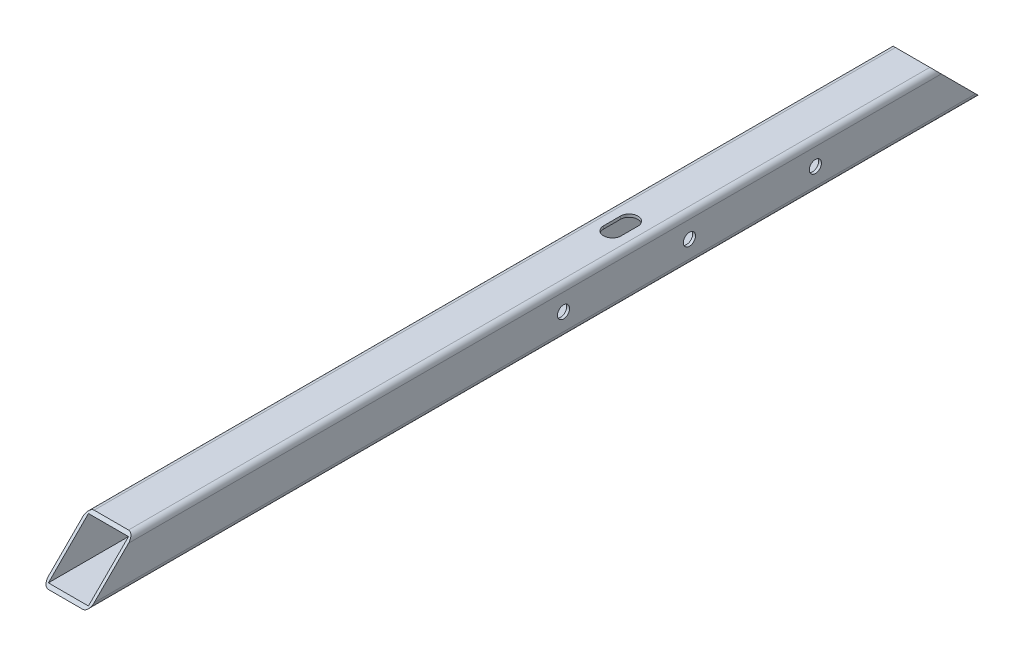
ISO-10303-21;
HEADER;
FILE_DESCRIPTION(('STEP AP214'),'2;1');
FILE_NAME('part.step','',(''),(''),'','','');
FILE_SCHEMA(('AUTOMOTIVE_DESIGN { 1 0 10303 214 1 1 1 1 }'));
ENDSEC;
DATA;
#1=APPLICATION_CONTEXT('core data for automotive mechanical design processes');
#2=APPLICATION_PROTOCOL_DEFINITION('international standard','automotive_design',2000,#1);
#3=PRODUCT_CONTEXT('',#1,'mechanical');
#4=PRODUCT('Part','Part','',(#3));
#5=PRODUCT_RELATED_PRODUCT_CATEGORY('part','',(#4));
#6=PRODUCT_DEFINITION_FORMATION('','',#4);
#7=PRODUCT_DEFINITION_CONTEXT('part definition',#1,'design');
#8=PRODUCT_DEFINITION('design','',#6,#7);
#9=PRODUCT_DEFINITION_SHAPE('','',#8);
#10=(LENGTH_UNIT() NAMED_UNIT(*) SI_UNIT(.MILLI.,.METRE.));
#11=(NAMED_UNIT(*) PLANE_ANGLE_UNIT() SI_UNIT($,.RADIAN.));
#12=(NAMED_UNIT(*) SI_UNIT($,.STERADIAN.) SOLID_ANGLE_UNIT());
#13=UNCERTAINTY_MEASURE_WITH_UNIT(LENGTH_MEASURE(1.E-05),#10,'distance_accuracy_value','');
#14=(GEOMETRIC_REPRESENTATION_CONTEXT(3) GLOBAL_UNCERTAINTY_ASSIGNED_CONTEXT((#13)) GLOBAL_UNIT_ASSIGNED_CONTEXT((#10,
#11,#12)) REPRESENTATION_CONTEXT('',''));
#15=CARTESIAN_POINT('',(0.,0.,0.));
#16=DIRECTION('',(0.,0.,1.));
#17=DIRECTION('',(1.,0.,0.));
#18=AXIS2_PLACEMENT_3D('',#15,#16,#17);
#19=CARTESIAN_POINT('',(25.4,25.4,495.3));
#20=DIRECTION('',(0.,-1.,0.));
#21=DIRECTION('',(1.,0.,0.));
#22=AXIS2_PLACEMENT_3D('',#19,#20,#21);
#23=PLANE('',#22);
#24=DIRECTION('',(0.,0.,-1.));
#25=VECTOR('',#24,1.);
#26=CARTESIAN_POINT('',(19.05,25.4,495.3));
#27=LINE('',#26,#25);
#28=CARTESIAN_POINT('',(19.0500000000002,25.4,444.5));
#29=VERTEX_POINT('',#28);
#30=CARTESIAN_POINT('',(19.05,25.4,-444.500000000001));
#31=VERTEX_POINT('',#30);
#32=EDGE_CURVE('E457',#29,#31,#27,.T.);
#33=ORIENTED_EDGE('',*,*,#32,.T.);
#34=DIRECTION('',(-1.,0.,0.));
#35=VECTOR('',#34,1.);
#36=CARTESIAN_POINT('',(889.,25.4,-444.5));
#37=LINE('',#36,#35);
#38=CARTESIAN_POINT('',(-19.05,25.4,-444.5));
#39=VERTEX_POINT('',#38);
#40=EDGE_CURVE('E361',#31,#39,#37,.T.);
#41=ORIENTED_EDGE('',*,*,#40,.T.);
#42=DIRECTION('',(0.,0.,-1.));
#43=VECTOR('',#42,1.);
#44=CARTESIAN_POINT('',(-19.05,25.4,495.3));
#45=LINE('',#44,#43);
#46=CARTESIAN_POINT('',(-19.0499999999998,25.4,444.5));
#47=VERTEX_POINT('',#46);
#48=EDGE_CURVE('E461',#39,#47,#45,.F.);
#49=ORIENTED_EDGE('',*,*,#48,.T.);
#50=DIRECTION('',(-1.,0.,0.));
#51=VECTOR('',#50,1.);
#52=CARTESIAN_POINT('',(889.,25.4,444.5));
#53=LINE('',#52,#51);
#54=EDGE_CURVE('E385',#29,#47,#53,.T.);
#55=ORIENTED_EDGE('',*,*,#54,.F.);
#56=EDGE_LOOP('',(#33,#41,#49,#55));
#57=FACE_BOUND('',#56,.T.);
#58=DIRECTION('',(0.,0.,-1.));
#59=VECTOR('',#58,1.);
#60=CARTESIAN_POINT('',(9.72311999999999,25.4,-111.32312));
#61=LINE('',#60,#59);
#62=CARTESIAN_POINT('',(9.72311999999999,25.4,-111.32312));
#63=VERTEX_POINT('',#62);
#64=CARTESIAN_POINT('',(9.72311999999999,25.4,-129.97688));
#65=VERTEX_POINT('',#64);
#66=EDGE_CURVE('E283',#63,#65,#61,.T.);
#67=ORIENTED_EDGE('',*,*,#66,.F.);
#68=CARTESIAN_POINT('',(0.,25.4,-111.32312));
#69=DIRECTION('',(0.,-1.,0.));
#70=DIRECTION('',(0.,0.,-1.));
#71=AXIS2_PLACEMENT_3D('',#68,#69,#70);
#72=CIRCLE('',#71,9.72311999999999);
#73=CARTESIAN_POINT('',(-9.72311999999998,25.4,-111.32312));
#74=VERTEX_POINT('',#73);
#75=EDGE_CURVE('E295',#63,#74,#72,.T.);
#76=ORIENTED_EDGE('',*,*,#75,.T.);
#77=DIRECTION('',(0.,0.,-1.));
#78=VECTOR('',#77,1.);
#79=CARTESIAN_POINT('',(-9.72311999999998,25.4,-111.32312));
#80=LINE('',#79,#78);
#81=CARTESIAN_POINT('',(-9.72311999999998,25.4,-129.97688));
#82=VERTEX_POINT('',#81);
#83=EDGE_CURVE('E501',#74,#82,#80,.T.);
#84=ORIENTED_EDGE('',*,*,#83,.T.);
#85=CARTESIAN_POINT('',(0.,25.4,-129.97688));
#86=DIRECTION('',(0.,-1.,0.));
#87=DIRECTION('',(0.,0.,-1.));
#88=AXIS2_PLACEMENT_3D('',#85,#86,#87);
#89=CIRCLE('',#88,9.72311999999999);
#90=EDGE_CURVE('E138',#82,#65,#89,.T.);
#91=ORIENTED_EDGE('',*,*,#90,.T.);
#92=EDGE_LOOP('',(#67,#76,#84,#91));
#93=FACE_BOUND('',#92,.T.);
#94=ADVANCED_FACE('F114',(#57,#93),#23,.F.);
#95=CARTESIAN_POINT('',(22.225,-22.225,495.3));
#96=DIRECTION('',(0.,1.,0.));
#97=DIRECTION('',(0.,0.,1.));
#98=AXIS2_PLACEMENT_3D('',#95,#96,#97);
#99=PLANE('',#98);
#100=DIRECTION('',(1.,0.,0.));
#101=VECTOR('',#100,1.);
#102=CARTESIAN_POINT('',(22.225,-22.225,-492.125));
#103=LINE('',#102,#101);
#104=CARTESIAN_POINT('',(-22.225,-22.225,-492.125));
#105=VERTEX_POINT('',#104);
#106=CARTESIAN_POINT('',(22.225,-22.2250000000001,-492.125));
#107=VERTEX_POINT('',#106);
#108=EDGE_CURVE('E377',#105,#107,#103,.T.);
#109=ORIENTED_EDGE('',*,*,#108,.F.);
#110=DIRECTION('',(0.,0.,-1.));
#111=VECTOR('',#110,1.);
#112=CARTESIAN_POINT('',(-22.225,-22.225,495.3));
#113=LINE('',#112,#111);
#114=CARTESIAN_POINT('',(-22.225,-22.225,492.125));
#115=VERTEX_POINT('',#114);
#116=EDGE_CURVE('E425',#115,#105,#113,.T.);
#117=ORIENTED_EDGE('',*,*,#116,.F.);
#118=DIRECTION('',(-1.,0.,0.));
#119=VECTOR('',#118,1.);
#120=CARTESIAN_POINT('',(22.225,-22.225,492.125));
#121=LINE('',#120,#119);
#122=CARTESIAN_POINT('',(22.225,-22.225,492.125));
#123=VERTEX_POINT('',#122);
#124=EDGE_CURVE('E407',#123,#115,#121,.T.);
#125=ORIENTED_EDGE('',*,*,#124,.F.);
#126=DIRECTION('',(0.,0.,-1.));
#127=VECTOR('',#126,1.);
#128=CARTESIAN_POINT('',(22.225,-22.225,495.3));
#129=LINE('',#128,#127);
#130=EDGE_CURVE('E421',#123,#107,#129,.T.);
#131=ORIENTED_EDGE('',*,*,#130,.T.);
#132=EDGE_LOOP('',(#109,#117,#125,#131));
#133=FACE_BOUND('',#132,.T.);
#134=CARTESIAN_POINT('',(0.,-22.225,-129.97688));
#135=DIRECTION('',(0.,1.,0.));
#136=DIRECTION('',(0.,0.,1.));
#137=AXIS2_PLACEMENT_3D('',#134,#135,#136);
#138=CIRCLE('',#137,9.72311999999999);
#139=CARTESIAN_POINT('',(9.72312,-22.225,-129.97688));
#140=VERTEX_POINT('',#139);
#141=CARTESIAN_POINT('',(-9.72311999999999,-22.225,-129.97688));
#142=VERTEX_POINT('',#141);
#143=EDGE_CURVE('E319',#140,#142,#138,.T.);
#144=ORIENTED_EDGE('',*,*,#143,.F.);
#145=DIRECTION('',(0.,0.,1.));
#146=VECTOR('',#145,1.);
#147=CARTESIAN_POINT('',(9.72311999999988,-22.225,495.3));
#148=LINE('',#147,#146);
#149=CARTESIAN_POINT('',(9.72311999999999,-22.225,-111.32312));
#150=VERTEX_POINT('',#149);
#151=EDGE_CURVE('E323',#140,#150,#148,.T.);
#152=ORIENTED_EDGE('',*,*,#151,.T.);
#153=CARTESIAN_POINT('',(0.,-22.225,-111.32312));
#154=DIRECTION('',(0.,1.,0.));
#155=DIRECTION('',(0.,0.,1.));
#156=AXIS2_PLACEMENT_3D('',#153,#154,#155);
#157=CIRCLE('',#156,9.72311999999999);
#158=CARTESIAN_POINT('',(-9.72311999999999,-22.225,-111.32312));
#159=VERTEX_POINT('',#158);
#160=EDGE_CURVE('E287',#159,#150,#157,.T.);
#161=ORIENTED_EDGE('',*,*,#160,.F.);
#162=DIRECTION('',(0.,0.,1.));
#163=VECTOR('',#162,1.);
#164=CARTESIAN_POINT('',(-9.7231200000001,-22.225,495.3));
#165=LINE('',#164,#163);
#166=EDGE_CURVE('E315',#142,#159,#165,.T.);
#167=ORIENTED_EDGE('',*,*,#166,.F.);
#168=EDGE_LOOP('',(#144,#152,#161,#167));
#169=FACE_BOUND('',#168,.T.);
#170=ADVANCED_FACE('F514',(#133,#169),#99,.T.);
#171=CARTESIAN_POINT('',(22.225,22.225,495.3));
#172=DIRECTION('',(0.,-1.,0.));
#173=DIRECTION('',(0.,0.,-1.));
#174=AXIS2_PLACEMENT_3D('',#171,#172,#173);
#175=PLANE('',#174);
#176=DIRECTION('',(-1.,0.,0.));
#177=VECTOR('',#176,1.);
#178=CARTESIAN_POINT('',(22.225,22.225,-447.675));
#179=LINE('',#178,#177);
#180=CARTESIAN_POINT('',(22.225,22.225,-447.675));
#181=VERTEX_POINT('',#180);
#182=CARTESIAN_POINT('',(-22.225,22.225,-447.675));
#183=VERTEX_POINT('',#182);
#184=EDGE_CURVE('E373',#181,#183,#179,.T.);
#185=ORIENTED_EDGE('',*,*,#184,.F.);
#186=DIRECTION('',(0.,0.,-1.));
#187=VECTOR('',#186,1.);
#188=CARTESIAN_POINT('',(22.225,22.225,495.3));
#189=LINE('',#188,#187);
#190=CARTESIAN_POINT('',(22.225,22.225,447.675));
#191=VERTEX_POINT('',#190);
#192=EDGE_CURVE('E417',#191,#181,#189,.T.);
#193=ORIENTED_EDGE('',*,*,#192,.F.);
#194=DIRECTION('',(1.,0.,0.));
#195=VECTOR('',#194,1.);
#196=CARTESIAN_POINT('',(22.225,22.225,447.675));
#197=LINE('',#196,#195);
#198=CARTESIAN_POINT('',(-22.225,22.225,447.675));
#199=VERTEX_POINT('',#198);
#200=EDGE_CURVE('E401',#199,#191,#197,.T.);
#201=ORIENTED_EDGE('',*,*,#200,.F.);
#202=DIRECTION('',(0.,0.,-1.));
#203=VECTOR('',#202,1.);
#204=CARTESIAN_POINT('',(-22.225,22.225,495.3));
#205=LINE('',#204,#203);
#206=EDGE_CURVE('E413',#199,#183,#205,.T.);
#207=ORIENTED_EDGE('',*,*,#206,.T.);
#208=EDGE_LOOP('',(#185,#193,#201,#207));
#209=FACE_BOUND('',#208,.T.);
#210=CARTESIAN_POINT('',(0.,22.225,-111.32312));
#211=DIRECTION('',(0.,-1.,0.));
#212=DIRECTION('',(0.,0.,-1.));
#213=AXIS2_PLACEMENT_3D('',#210,#211,#212);
#214=CIRCLE('',#213,9.72311999999999);
#215=CARTESIAN_POINT('',(9.72311999999999,22.225,-111.32312));
#216=VERTEX_POINT('',#215);
#217=CARTESIAN_POINT('',(-9.72311999999999,22.225,-111.32312));
#218=VERTEX_POINT('',#217);
#219=EDGE_CURVE('E478',#216,#218,#214,.T.);
#220=ORIENTED_EDGE('',*,*,#219,.F.);
#221=DIRECTION('',(0.,0.,-1.));
#222=VECTOR('',#221,1.);
#223=CARTESIAN_POINT('',(9.72311999999988,22.225,495.3));
#224=LINE('',#223,#222);
#225=CARTESIAN_POINT('',(9.72311999999999,22.225,-129.97688));
#226=VERTEX_POINT('',#225);
#227=EDGE_CURVE('E13',#216,#226,#224,.T.);
#228=ORIENTED_EDGE('',*,*,#227,.T.);
#229=CARTESIAN_POINT('',(0.,22.225,-129.97688));
#230=DIRECTION('',(0.,-1.,0.));
#231=DIRECTION('',(0.,0.,-1.));
#232=AXIS2_PLACEMENT_3D('',#229,#230,#231);
#233=CIRCLE('',#232,9.72311999999999);
#234=CARTESIAN_POINT('',(-9.72311999999998,22.225,-129.97688));
#235=VERTEX_POINT('',#234);
#236=EDGE_CURVE('E123',#235,#226,#233,.T.);
#237=ORIENTED_EDGE('',*,*,#236,.F.);
#238=DIRECTION('',(0.,0.,-1.));
#239=VECTOR('',#238,1.);
#240=CARTESIAN_POINT('',(-9.7231200000001,22.225,495.3));
#241=LINE('',#240,#239);
#242=EDGE_CURVE('E469',#218,#235,#241,.T.);
#243=ORIENTED_EDGE('',*,*,#242,.F.);
#244=EDGE_LOOP('',(#220,#228,#237,#243));
#245=FACE_BOUND('',#244,.T.);
#246=ADVANCED_FACE('F494',(#209,#245),#175,.T.);
#247=CARTESIAN_POINT('',(-25.4,-25.4,495.3));
#248=DIRECTION('',(1.,0.,0.));
#249=DIRECTION('',(0.,0.,-1.));
#250=AXIS2_PLACEMENT_3D('',#247,#248,#249);
#251=PLANE('',#250);
#252=CARTESIAN_POINT('',(-25.4,0.,-171.45));
#253=DIRECTION('',(-1.,0.,0.));
#254=DIRECTION('',(0.,0.,1.));
#255=AXIS2_PLACEMENT_3D('',#252,#253,#254);
#256=CIRCLE('',#255,6.74623999999999);
#257=CARTESIAN_POINT('',(-25.4,0.,-164.70376));
#258=VERTEX_POINT('',#257);
#259=EDGE_CURVE('E326',#258,#258,#256,.T.);
#260=ORIENTED_EDGE('',*,*,#259,.F.);
#261=EDGE_LOOP('',(#260));
#262=FACE_BOUND('',#261,.T.);
#263=CARTESIAN_POINT('',(-25.4,0.,-311.15));
#264=DIRECTION('',(-1.,0.,0.));
#265=DIRECTION('',(0.,0.,1.));
#266=AXIS2_PLACEMENT_3D('',#263,#264,#265);
#267=CIRCLE('',#266,6.74623999999999);
#268=CARTESIAN_POINT('',(-25.4,0.,-304.40376));
#269=VERTEX_POINT('',#268);
#270=EDGE_CURVE('E336',#269,#269,#267,.T.);
#271=ORIENTED_EDGE('',*,*,#270,.F.);
#272=EDGE_LOOP('',(#271));
#273=FACE_BOUND('',#272,.T.);
#274=CARTESIAN_POINT('',(-25.4,0.,-31.7499999999999));
#275=DIRECTION('',(-1.,0.,0.));
#276=DIRECTION('',(0.,0.,1.));
#277=AXIS2_PLACEMENT_3D('',#274,#275,#276);
#278=CIRCLE('',#277,6.74623999999999);
#279=CARTESIAN_POINT('',(-25.4,0.,-25.00376));
#280=VERTEX_POINT('',#279);
#281=EDGE_CURVE('E346',#280,#280,#278,.T.);
#282=ORIENTED_EDGE('',*,*,#281,.F.);
#283=EDGE_LOOP('',(#282));
#284=FACE_BOUND('',#283,.T.);
#285=DIRECTION('',(0.,0.,-1.));
#286=VECTOR('',#285,1.);
#287=CARTESIAN_POINT('',(-25.4,19.05,495.3));
#288=LINE('',#287,#286);
#289=CARTESIAN_POINT('',(-25.4,19.05,450.85));
#290=VERTEX_POINT('',#289);
#291=CARTESIAN_POINT('',(-25.4,19.05,-450.85));
#292=VERTEX_POINT('',#291);
#293=EDGE_CURVE('E450',#290,#292,#288,.T.);
#294=ORIENTED_EDGE('',*,*,#293,.T.);
#295=DIRECTION('',(0.,0.707106781186551,0.707106781186544));
#296=VECTOR('',#295,1.);
#297=CARTESIAN_POINT('',(-25.4,-25.4,-495.3));
#298=LINE('',#297,#296);
#299=CARTESIAN_POINT('',(-25.4,-19.05,-488.95));
#300=VERTEX_POINT('',#299);
#301=EDGE_CURVE('E359',#300,#292,#298,.T.);
#302=ORIENTED_EDGE('',*,*,#301,.F.);
#303=DIRECTION('',(0.,0.,-1.));
#304=VECTOR('',#303,1.);
#305=CARTESIAN_POINT('',(-25.4,-19.05,495.3));
#306=LINE('',#305,#304);
#307=CARTESIAN_POINT('',(-25.4,-19.05,488.95));
#308=VERTEX_POINT('',#307);
#309=EDGE_CURVE('E454',#300,#308,#306,.F.);
#310=ORIENTED_EDGE('',*,*,#309,.T.);
#311=DIRECTION('',(0.,-0.707106781186551,0.707106781186544));
#312=VECTOR('',#311,1.);
#313=CARTESIAN_POINT('',(-25.4,-25.4,495.3));
#314=LINE('',#313,#312);
#315=EDGE_CURVE('E381',#290,#308,#314,.T.);
#316=ORIENTED_EDGE('',*,*,#315,.F.);
#317=EDGE_LOOP('',(#294,#302,#310,#316));
#318=FACE_BOUND('',#317,.T.);
#319=ADVANCED_FACE('F522',(#262,#273,#284,#318),#251,.F.);
#320=CARTESIAN_POINT('',(25.4,-25.4,495.3));
#321=DIRECTION('',(0.,1.,0.));
#322=DIRECTION('',(-1.,0.,0.));
#323=AXIS2_PLACEMENT_3D('',#320,#321,#322);
#324=PLANE('',#323);
#325=CARTESIAN_POINT('',(0.,-25.4,-111.32312));
#326=DIRECTION('',(0.,-1.,0.));
#327=DIRECTION('',(0.,0.,-1.));
#328=AXIS2_PLACEMENT_3D('',#325,#326,#327);
#329=CIRCLE('',#328,9.72311999999999);
#330=CARTESIAN_POINT('',(9.72311999999999,-25.4,-111.32312));
#331=VERTEX_POINT('',#330);
#332=CARTESIAN_POINT('',(-9.72311999999999,-25.4,-111.32312));
#333=VERTEX_POINT('',#332);
#334=EDGE_CURVE('E130',#331,#333,#329,.T.);
#335=ORIENTED_EDGE('',*,*,#334,.F.);
#336=DIRECTION('',(0.,0.,-1.));
#337=VECTOR('',#336,1.);
#338=CARTESIAN_POINT('',(9.72311999999999,-25.4,-111.32312));
#339=LINE('',#338,#337);
#340=CARTESIAN_POINT('',(9.72312,-25.4,-129.97688));
#341=VERTEX_POINT('',#340);
#342=EDGE_CURVE('E273',#331,#341,#339,.T.);
#343=ORIENTED_EDGE('',*,*,#342,.T.);
#344=CARTESIAN_POINT('',(0.,-25.4,-129.97688));
#345=DIRECTION('',(0.,-1.,0.));
#346=DIRECTION('',(0.,0.,-1.));
#347=AXIS2_PLACEMENT_3D('',#344,#345,#346);
#348=CIRCLE('',#347,9.72311999999999);
#349=CARTESIAN_POINT('',(-9.72312000000003,-25.4,-129.97688));
#350=VERTEX_POINT('',#349);
#351=EDGE_CURVE('E308',#350,#341,#348,.T.);
#352=ORIENTED_EDGE('',*,*,#351,.F.);
#353=DIRECTION('',(0.,0.,-1.));
#354=VECTOR('',#353,1.);
#355=CARTESIAN_POINT('',(-9.72312000000003,-25.4,-111.32312));
#356=LINE('',#355,#354);
#357=EDGE_CURVE('E293',#333,#350,#356,.T.);
#358=ORIENTED_EDGE('',*,*,#357,.F.);
#359=EDGE_LOOP('',(#335,#343,#352,#358));
#360=FACE_BOUND('',#359,.T.);
#361=DIRECTION('',(1.,0.,0.));
#362=VECTOR('',#361,1.);
#363=CARTESIAN_POINT('',(25.4,-25.4,-495.3));
#364=LINE('',#363,#362);
#365=CARTESIAN_POINT('',(-19.05,-25.4,-495.3));
#366=VERTEX_POINT('',#365);
#367=CARTESIAN_POINT('',(19.05,-25.4,-495.3));
#368=VERTEX_POINT('',#367);
#369=EDGE_CURVE('E429',#366,#368,#364,.T.);
#370=ORIENTED_EDGE('',*,*,#369,.T.);
#371=DIRECTION('',(0.,0.,-1.));
#372=VECTOR('',#371,1.);
#373=CARTESIAN_POINT('',(19.05,-25.4,495.3));
#374=LINE('',#373,#372);
#375=CARTESIAN_POINT('',(19.05,-25.4,495.3));
#376=VERTEX_POINT('',#375);
#377=EDGE_CURVE('E446',#368,#376,#374,.F.);
#378=ORIENTED_EDGE('',*,*,#377,.T.);
#379=DIRECTION('',(1.,0.,0.));
#380=VECTOR('',#379,1.);
#381=CARTESIAN_POINT('',(25.4,-25.4,495.3));
#382=LINE('',#381,#380);
#383=CARTESIAN_POINT('',(-19.05,-25.4,495.3));
#384=VERTEX_POINT('',#383);
#385=EDGE_CURVE('E430',#384,#376,#382,.T.);
#386=ORIENTED_EDGE('',*,*,#385,.F.);
#387=DIRECTION('',(0.,0.,-1.));
#388=VECTOR('',#387,1.);
#389=CARTESIAN_POINT('',(-19.05,-25.4,495.3));
#390=LINE('',#389,#388);
#391=EDGE_CURVE('E442',#384,#366,#390,.T.);
#392=ORIENTED_EDGE('',*,*,#391,.T.);
#393=EDGE_LOOP('',(#370,#378,#386,#392));
#394=FACE_BOUND('',#393,.T.);
#395=ADVANCED_FACE('F291',(#360,#394),#324,.F.);
#396=CARTESIAN_POINT('',(25.4,-25.4,495.3));
#397=DIRECTION('',(-1.,0.,0.));
#398=DIRECTION('',(0.,0.,1.));
#399=AXIS2_PLACEMENT_3D('',#396,#397,#398);
#400=PLANE('',#399);
#401=CARTESIAN_POINT('',(25.4,0.,-171.45));
#402=DIRECTION('',(-1.,0.,0.));
#403=DIRECTION('',(0.,0.,1.));
#404=AXIS2_PLACEMENT_3D('',#401,#402,#403);
#405=CIRCLE('',#404,6.74623999999999);
#406=CARTESIAN_POINT('',(25.4,0.,-164.70376));
#407=VERTEX_POINT('',#406);
#408=EDGE_CURVE('E329',#407,#407,#405,.T.);
#409=ORIENTED_EDGE('',*,*,#408,.T.);
#410=EDGE_LOOP('',(#409));
#411=FACE_BOUND('',#410,.T.);
#412=CARTESIAN_POINT('',(25.4,0.,-311.15));
#413=DIRECTION('',(-1.,0.,0.));
#414=DIRECTION('',(0.,0.,1.));
#415=AXIS2_PLACEMENT_3D('',#412,#413,#414);
#416=CIRCLE('',#415,6.74623999999999);
#417=CARTESIAN_POINT('',(25.4,0.,-304.40376));
#418=VERTEX_POINT('',#417);
#419=EDGE_CURVE('E339',#418,#418,#416,.T.);
#420=ORIENTED_EDGE('',*,*,#419,.T.);
#421=EDGE_LOOP('',(#420));
#422=FACE_BOUND('',#421,.T.);
#423=CARTESIAN_POINT('',(25.4,0.,-31.7499999999999));
#424=DIRECTION('',(-1.,0.,0.));
#425=DIRECTION('',(0.,0.,1.));
#426=AXIS2_PLACEMENT_3D('',#423,#424,#425);
#427=CIRCLE('',#426,6.74623999999999);
#428=CARTESIAN_POINT('',(25.4,0.,-25.00376));
#429=VERTEX_POINT('',#428);
#430=EDGE_CURVE('E350',#429,#429,#427,.T.);
#431=ORIENTED_EDGE('',*,*,#430,.T.);
#432=EDGE_LOOP('',(#431));
#433=FACE_BOUND('',#432,.T.);
#434=DIRECTION('',(0.,0.,-1.));
#435=VECTOR('',#434,1.);
#436=CARTESIAN_POINT('',(25.4,-19.05,495.3));
#437=LINE('',#436,#435);
#438=CARTESIAN_POINT('',(25.4,-19.05,488.95));
#439=VERTEX_POINT('',#438);
#440=CARTESIAN_POINT('',(25.4,-19.05,-488.95));
#441=VERTEX_POINT('',#440);
#442=EDGE_CURVE('E438',#439,#441,#437,.T.);
#443=ORIENTED_EDGE('',*,*,#442,.T.);
#444=DIRECTION('',(0.,0.707106781186551,0.707106781186544));
#445=VECTOR('',#444,1.);
#446=CARTESIAN_POINT('',(25.4,469.9,-4.82947015711943E-12));
#447=LINE('',#446,#445);
#448=CARTESIAN_POINT('',(25.4,19.05,-450.85));
#449=VERTEX_POINT('',#448);
#450=EDGE_CURVE('E364',#441,#449,#447,.T.);
#451=ORIENTED_EDGE('',*,*,#450,.T.);
#452=DIRECTION('',(0.,0.,-1.));
#453=VECTOR('',#452,1.);
#454=CARTESIAN_POINT('',(25.4,19.05,495.3));
#455=LINE('',#454,#453);
#456=CARTESIAN_POINT('',(25.4,19.05,450.85));
#457=VERTEX_POINT('',#456);
#458=EDGE_CURVE('E433',#449,#457,#455,.F.);
#459=ORIENTED_EDGE('',*,*,#458,.T.);
#460=DIRECTION('',(0.,-0.707106781186551,0.707106781186544));
#461=VECTOR('',#460,1.);
#462=CARTESIAN_POINT('',(25.4,-25.4,495.3));
#463=LINE('',#462,#461);
#464=EDGE_CURVE('E389',#457,#439,#463,.T.);
#465=ORIENTED_EDGE('',*,*,#464,.T.);
#466=EDGE_LOOP('',(#443,#451,#459,#465));
#467=FACE_BOUND('',#466,.T.);
#468=ADVANCED_FACE('F533',(#411,#422,#433,#467),#400,.F.);
#469=CARTESIAN_POINT('',(-22.225,-22.225,495.3));
#470=DIRECTION('',(1.,0.,0.));
#471=DIRECTION('',(0.,0.,-1.));
#472=AXIS2_PLACEMENT_3D('',#469,#470,#471);
#473=PLANE('',#472);
#474=CARTESIAN_POINT('',(-22.225,0.,-171.45));
#475=DIRECTION('',(1.,0.,0.));
#476=DIRECTION('',(0.,0.,-1.));
#477=AXIS2_PLACEMENT_3D('',#474,#475,#476);
#478=CIRCLE('',#477,6.74623999999999);
#479=CARTESIAN_POINT('',(-22.225,0.,-178.19624));
#480=VERTEX_POINT('',#479);
#481=EDGE_CURVE('E333',#480,#480,#478,.T.);
#482=ORIENTED_EDGE('',*,*,#481,.F.);
#483=EDGE_LOOP('',(#482));
#484=FACE_BOUND('',#483,.T.);
#485=CARTESIAN_POINT('',(-22.225,0.,-311.15));
#486=DIRECTION('',(1.,0.,0.));
#487=DIRECTION('',(0.,0.,-1.));
#488=AXIS2_PLACEMENT_3D('',#485,#486,#487);
#489=CIRCLE('',#488,6.74623999999999);
#490=CARTESIAN_POINT('',(-22.225,0.,-317.89624));
#491=VERTEX_POINT('',#490);
#492=EDGE_CURVE('E343',#491,#491,#489,.T.);
#493=ORIENTED_EDGE('',*,*,#492,.F.);
#494=EDGE_LOOP('',(#493));
#495=FACE_BOUND('',#494,.T.);
#496=CARTESIAN_POINT('',(-22.225,0.,-31.7499999999999));
#497=DIRECTION('',(1.,0.,0.));
#498=DIRECTION('',(0.,0.,-1.));
#499=AXIS2_PLACEMENT_3D('',#496,#497,#498);
#500=CIRCLE('',#499,6.74623999999999);
#501=CARTESIAN_POINT('',(-22.225,0.,-38.4962399999999));
#502=VERTEX_POINT('',#501);
#503=EDGE_CURVE('E355',#502,#502,#500,.T.);
#504=ORIENTED_EDGE('',*,*,#503,.F.);
#505=EDGE_LOOP('',(#504));
#506=FACE_BOUND('',#505,.T.);
#507=DIRECTION('',(0.,-0.707106781186551,-0.707106781186544));
#508=VECTOR('',#507,1.);
#509=CARTESIAN_POINT('',(-22.225,471.4875,1.58749999999519));
#510=LINE('',#509,#508);
#511=EDGE_CURVE('E379',#183,#105,#510,.T.);
#512=ORIENTED_EDGE('',*,*,#511,.F.);
#513=ORIENTED_EDGE('',*,*,#206,.F.);
#514=DIRECTION('',(0.,0.707106781186551,-0.707106781186544));
#515=VECTOR('',#514,1.);
#516=CARTESIAN_POINT('',(-22.225,-23.8125,493.7125));
#517=LINE('',#516,#515);
#518=EDGE_CURVE('E410',#115,#199,#517,.T.);
#519=ORIENTED_EDGE('',*,*,#518,.F.);
#520=ORIENTED_EDGE('',*,*,#116,.T.);
#521=EDGE_LOOP('',(#512,#513,#519,#520));
#522=FACE_BOUND('',#521,.T.);
#523=ADVANCED_FACE('F531',(#484,#495,#506,#522),#473,.T.);
#524=CARTESIAN_POINT('',(22.225,-22.225,495.3));
#525=DIRECTION('',(-1.,0.,0.));
#526=DIRECTION('',(0.,0.,1.));
#527=AXIS2_PLACEMENT_3D('',#524,#525,#526);
#528=PLANE('',#527);
#529=CARTESIAN_POINT('',(22.225,0.,-171.45));
#530=DIRECTION('',(-1.,0.,0.));
#531=DIRECTION('',(0.,0.,1.));
#532=AXIS2_PLACEMENT_3D('',#529,#530,#531);
#533=CIRCLE('',#532,6.74623999999999);
#534=CARTESIAN_POINT('',(22.225,0.,-164.70376));
#535=VERTEX_POINT('',#534);
#536=EDGE_CURVE('E332',#535,#535,#533,.T.);
#537=ORIENTED_EDGE('',*,*,#536,.F.);
#538=EDGE_LOOP('',(#537));
#539=FACE_BOUND('',#538,.T.);
#540=CARTESIAN_POINT('',(22.225,0.,-311.15));
#541=DIRECTION('',(-1.,0.,0.));
#542=DIRECTION('',(0.,0.,1.));
#543=AXIS2_PLACEMENT_3D('',#540,#541,#542);
#544=CIRCLE('',#543,6.74623999999999);
#545=CARTESIAN_POINT('',(22.225,0.,-304.40376));
#546=VERTEX_POINT('',#545);
#547=EDGE_CURVE('E342',#546,#546,#544,.T.);
#548=ORIENTED_EDGE('',*,*,#547,.F.);
#549=EDGE_LOOP('',(#548));
#550=FACE_BOUND('',#549,.T.);
#551=CARTESIAN_POINT('',(22.225,0.,-31.7499999999999));
#552=DIRECTION('',(-1.,0.,0.));
#553=DIRECTION('',(0.,0.,1.));
#554=AXIS2_PLACEMENT_3D('',#551,#552,#553);
#555=CIRCLE('',#554,6.74623999999999);
#556=CARTESIAN_POINT('',(22.225,0.,-25.00376));
#557=VERTEX_POINT('',#556);
#558=EDGE_CURVE('E354',#557,#557,#555,.T.);
#559=ORIENTED_EDGE('',*,*,#558,.F.);
#560=EDGE_LOOP('',(#559));
#561=FACE_BOUND('',#560,.T.);
#562=DIRECTION('',(0.,0.707106781186551,0.707106781186544));
#563=VECTOR('',#562,1.);
#564=CARTESIAN_POINT('',(22.225,471.4875,1.58749999999519));
#565=LINE('',#564,#563);
#566=EDGE_CURVE('E375',#107,#181,#565,.T.);
#567=ORIENTED_EDGE('',*,*,#566,.F.);
#568=ORIENTED_EDGE('',*,*,#130,.F.);
#569=DIRECTION('',(0.,-0.707106781186551,0.707106781186544));
#570=VECTOR('',#569,1.);
#571=CARTESIAN_POINT('',(22.225,-23.8125,493.7125));
#572=LINE('',#571,#570);
#573=EDGE_CURVE('E404',#191,#123,#572,.T.);
#574=ORIENTED_EDGE('',*,*,#573,.F.);
#575=ORIENTED_EDGE('',*,*,#192,.T.);
#576=EDGE_LOOP('',(#567,#568,#574,#575));
#577=FACE_BOUND('',#576,.T.);
#578=ADVANCED_FACE('F530',(#539,#550,#561,#577),#528,.T.);
#579=CARTESIAN_POINT('',(19.05,-19.05,495.3));
#580=DIRECTION('',(0.,0.,-1.));
#581=DIRECTION('',(-1.,0.,0.));
#582=AXIS2_PLACEMENT_3D('',#579,#580,#581);
#583=CYLINDRICAL_SURFACE('',#582,6.35);
#584=CARTESIAN_POINT('',(19.05,-19.05,-488.95));
#585=DIRECTION('',(0.,-0.707106781186544,0.707106781186551));
#586=DIRECTION('',(0.,-0.707106781186551,-0.707106781186544));
#587=AXIS2_PLACEMENT_3D('',#584,#585,#586);
#588=ELLIPSE('',#587,8.98025612106911,6.35);
#589=EDGE_CURVE('E367',#441,#368,#588,.F.);
#590=ORIENTED_EDGE('',*,*,#589,.F.);
#591=ORIENTED_EDGE('',*,*,#442,.F.);
#592=CARTESIAN_POINT('',(19.05,-19.05,488.95));
#593=DIRECTION('',(0.,-0.707106781186544,-0.707106781186551));
#594=DIRECTION('',(0.,0.707106781186551,-0.707106781186544));
#595=AXIS2_PLACEMENT_3D('',#592,#593,#594);
#596=ELLIPSE('',#595,8.98025612106911,6.35);
#597=EDGE_CURVE('E393',#376,#439,#596,.F.);
#598=ORIENTED_EDGE('',*,*,#597,.F.);
#599=ORIENTED_EDGE('',*,*,#377,.F.);
#600=EDGE_LOOP('',(#590,#591,#598,#599));
#601=FACE_BOUND('',#600,.T.);
#602=ADVANCED_FACE('F544',(#601),#583,.T.);
#603=CARTESIAN_POINT('',(-19.05,-19.05,495.3));
#604=DIRECTION('',(0.,0.,-1.));
#605=DIRECTION('',(-1.,0.,0.));
#606=AXIS2_PLACEMENT_3D('',#603,#604,#605);
#607=CYLINDRICAL_SURFACE('',#606,6.35);
#608=CARTESIAN_POINT('',(-19.05,-19.05,-488.95));
#609=DIRECTION('',(0.,-0.707106781186544,0.707106781186551));
#610=DIRECTION('',(0.,-0.707106781186551,-0.707106781186544));
#611=AXIS2_PLACEMENT_3D('',#608,#609,#610);
#612=ELLIPSE('',#611,8.98025612106911,6.35);
#613=EDGE_CURVE('E371',#366,#300,#612,.F.);
#614=ORIENTED_EDGE('',*,*,#613,.F.);
#615=ORIENTED_EDGE('',*,*,#391,.F.);
#616=CARTESIAN_POINT('',(-19.05,-19.05,488.95));
#617=DIRECTION('',(0.,-0.707106781186544,-0.707106781186551));
#618=DIRECTION('',(0.,0.707106781186551,-0.707106781186544));
#619=AXIS2_PLACEMENT_3D('',#616,#617,#618);
#620=ELLIPSE('',#619,8.98025612106911,6.35);
#621=EDGE_CURVE('E398',#308,#384,#620,.F.);
#622=ORIENTED_EDGE('',*,*,#621,.F.);
#623=ORIENTED_EDGE('',*,*,#309,.F.);
#624=EDGE_LOOP('',(#614,#615,#622,#623));
#625=FACE_BOUND('',#624,.T.);
#626=ADVANCED_FACE('F547',(#625),#607,.T.);
#627=CARTESIAN_POINT('',(-19.05,19.05,495.3));
#628=DIRECTION('',(0.,0.,-1.));
#629=DIRECTION('',(-1.,0.,0.));
#630=AXIS2_PLACEMENT_3D('',#627,#628,#629);
#631=CYLINDRICAL_SURFACE('',#630,6.35);
#632=CARTESIAN_POINT('',(-19.05,19.05,-450.85));
#633=DIRECTION('',(0.,-0.707106781186544,0.707106781186551));
#634=DIRECTION('',(0.,-0.707106781186551,-0.707106781186544));
#635=AXIS2_PLACEMENT_3D('',#632,#633,#634);
#636=ELLIPSE('',#635,8.98025612106911,6.35);
#637=EDGE_CURVE('E369',#292,#39,#636,.F.);
#638=ORIENTED_EDGE('',*,*,#637,.F.);
#639=ORIENTED_EDGE('',*,*,#293,.F.);
#640=CARTESIAN_POINT('',(-19.05,19.05,450.85));
#641=DIRECTION('',(0.,-0.707106781186544,-0.707106781186551));
#642=DIRECTION('',(0.,0.707106781186551,-0.707106781186544));
#643=AXIS2_PLACEMENT_3D('',#640,#641,#642);
#644=ELLIPSE('',#643,8.98025612106911,6.35);
#645=EDGE_CURVE('E395',#47,#290,#644,.F.);
#646=ORIENTED_EDGE('',*,*,#645,.F.);
#647=ORIENTED_EDGE('',*,*,#48,.F.);
#648=EDGE_LOOP('',(#638,#639,#646,#647));
#649=FACE_BOUND('',#648,.T.);
#650=ADVANCED_FACE('F550',(#649),#631,.T.);
#651=CARTESIAN_POINT('',(19.05,19.05,495.3));
#652=DIRECTION('',(0.,0.,-1.));
#653=DIRECTION('',(-1.,0.,0.));
#654=AXIS2_PLACEMENT_3D('',#651,#652,#653);
#655=CYLINDRICAL_SURFACE('',#654,6.35);
#656=CARTESIAN_POINT('',(19.05,19.05,-450.85));
#657=DIRECTION('',(0.,-0.707106781186544,0.707106781186551));
#658=DIRECTION('',(0.,-0.707106781186551,-0.707106781186544));
#659=AXIS2_PLACEMENT_3D('',#656,#657,#658);
#660=ELLIPSE('',#659,8.98025612106911,6.35);
#661=EDGE_CURVE('E467',#31,#449,#660,.F.);
#662=ORIENTED_EDGE('',*,*,#661,.F.);
#663=ORIENTED_EDGE('',*,*,#32,.F.);
#664=CARTESIAN_POINT('',(19.05,19.05,450.85));
#665=DIRECTION('',(0.,-0.707106781186544,-0.707106781186551));
#666=DIRECTION('',(0.,0.707106781186551,-0.707106781186544));
#667=AXIS2_PLACEMENT_3D('',#664,#665,#666);
#668=ELLIPSE('',#667,8.98025612106911,6.35);
#669=EDGE_CURVE('E464',#457,#29,#668,.F.);
#670=ORIENTED_EDGE('',*,*,#669,.F.);
#671=ORIENTED_EDGE('',*,*,#458,.F.);
#672=EDGE_LOOP('',(#662,#663,#670,#671));
#673=FACE_BOUND('',#672,.T.);
#674=ADVANCED_FACE('F116',(#673),#655,.T.);
#675=CARTESIAN_POINT('',(889.,-25.4,495.3));
#676=DIRECTION('',(0.,-0.707106781186544,-0.707106781186551));
#677=DIRECTION('',(0.,0.707106781186551,-0.707106781186544));
#678=AXIS2_PLACEMENT_3D('',#675,#676,#677);
#679=PLANE('',#678);
#680=ORIENTED_EDGE('',*,*,#518,.T.);
#681=ORIENTED_EDGE('',*,*,#200,.T.);
#682=ORIENTED_EDGE('',*,*,#573,.T.);
#683=ORIENTED_EDGE('',*,*,#124,.T.);
#684=EDGE_LOOP('',(#680,#681,#682,#683));
#685=FACE_BOUND('',#684,.T.);
#686=ORIENTED_EDGE('',*,*,#621,.T.);
#687=ORIENTED_EDGE('',*,*,#385,.T.);
#688=ORIENTED_EDGE('',*,*,#597,.T.);
#689=ORIENTED_EDGE('',*,*,#464,.F.);
#690=ORIENTED_EDGE('',*,*,#669,.T.);
#691=ORIENTED_EDGE('',*,*,#54,.T.);
#692=ORIENTED_EDGE('',*,*,#645,.T.);
#693=ORIENTED_EDGE('',*,*,#315,.T.);
#694=EDGE_LOOP('',(#686,#687,#688,#689,#690,#691,#692,#693));
#695=FACE_BOUND('',#694,.T.);
#696=ADVANCED_FACE('F557',(#685,#695),#679,.F.);
#697=CARTESIAN_POINT('',(889.,-25.4,-495.3));
#698=DIRECTION('',(0.,-0.707106781186544,0.707106781186551));
#699=DIRECTION('',(0.,-0.707106781186551,-0.707106781186544));
#700=AXIS2_PLACEMENT_3D('',#697,#698,#699);
#701=PLANE('',#700);
#702=ORIENTED_EDGE('',*,*,#511,.T.);
#703=ORIENTED_EDGE('',*,*,#108,.T.);
#704=ORIENTED_EDGE('',*,*,#566,.T.);
#705=ORIENTED_EDGE('',*,*,#184,.T.);
#706=EDGE_LOOP('',(#702,#703,#704,#705));
#707=FACE_BOUND('',#706,.T.);
#708=ORIENTED_EDGE('',*,*,#613,.T.);
#709=ORIENTED_EDGE('',*,*,#301,.T.);
#710=ORIENTED_EDGE('',*,*,#637,.T.);
#711=ORIENTED_EDGE('',*,*,#40,.F.);
#712=ORIENTED_EDGE('',*,*,#661,.T.);
#713=ORIENTED_EDGE('',*,*,#450,.F.);
#714=ORIENTED_EDGE('',*,*,#589,.T.);
#715=ORIENTED_EDGE('',*,*,#369,.F.);
#716=EDGE_LOOP('',(#708,#709,#710,#711,#712,#713,#714,#715));
#717=FACE_BOUND('',#716,.T.);
#718=ADVANCED_FACE('F585',(#707,#717),#701,.F.);
#719=CARTESIAN_POINT('',(-25.4,0.,-31.7499999999999));
#720=DIRECTION('',(-1.,0.,0.));
#721=DIRECTION('',(0.,0.,1.));
#722=AXIS2_PLACEMENT_3D('',#719,#720,#721);
#723=CYLINDRICAL_SURFACE('',#722,6.74623999999999);
#724=ORIENTED_EDGE('',*,*,#558,.T.);
#725=EDGE_LOOP('',(#724));
#726=FACE_BOUND('',#725,.T.);
#727=ORIENTED_EDGE('',*,*,#430,.F.);
#728=EDGE_LOOP('',(#727));
#729=FACE_BOUND('',#728,.T.);
#730=ADVANCED_FACE('F587',(#726,#729),#723,.F.);
#731=ORIENTED_EDGE('',*,*,#503,.T.);
#732=EDGE_LOOP('',(#731));
#733=FACE_BOUND('',#732,.T.);
#734=ORIENTED_EDGE('',*,*,#281,.T.);
#735=EDGE_LOOP('',(#734));
#736=FACE_BOUND('',#735,.T.);
#737=ADVANCED_FACE('F594',(#733,#736),#723,.F.);
#738=CARTESIAN_POINT('',(-25.4,0.,-311.15));
#739=DIRECTION('',(-1.,0.,0.));
#740=DIRECTION('',(0.,0.,1.));
#741=AXIS2_PLACEMENT_3D('',#738,#739,#740);
#742=CYLINDRICAL_SURFACE('',#741,6.74623999999999);
#743=ORIENTED_EDGE('',*,*,#547,.T.);
#744=EDGE_LOOP('',(#743));
#745=FACE_BOUND('',#744,.T.);
#746=ORIENTED_EDGE('',*,*,#419,.F.);
#747=EDGE_LOOP('',(#746));
#748=FACE_BOUND('',#747,.T.);
#749=ADVANCED_FACE('F600',(#745,#748),#742,.F.);
#750=ORIENTED_EDGE('',*,*,#492,.T.);
#751=EDGE_LOOP('',(#750));
#752=FACE_BOUND('',#751,.T.);
#753=ORIENTED_EDGE('',*,*,#270,.T.);
#754=EDGE_LOOP('',(#753));
#755=FACE_BOUND('',#754,.T.);
#756=ADVANCED_FACE('F603',(#752,#755),#742,.F.);
#757=CARTESIAN_POINT('',(-25.4,0.,-171.45));
#758=DIRECTION('',(-1.,0.,0.));
#759=DIRECTION('',(0.,0.,1.));
#760=AXIS2_PLACEMENT_3D('',#757,#758,#759);
#761=CYLINDRICAL_SURFACE('',#760,6.74623999999999);
#762=ORIENTED_EDGE('',*,*,#536,.T.);
#763=EDGE_LOOP('',(#762));
#764=FACE_BOUND('',#763,.T.);
#765=ORIENTED_EDGE('',*,*,#408,.F.);
#766=EDGE_LOOP('',(#765));
#767=FACE_BOUND('',#766,.T.);
#768=ADVANCED_FACE('F605',(#764,#767),#761,.F.);
#769=ORIENTED_EDGE('',*,*,#481,.T.);
#770=EDGE_LOOP('',(#769));
#771=FACE_BOUND('',#770,.T.);
#772=ORIENTED_EDGE('',*,*,#259,.T.);
#773=EDGE_LOOP('',(#772));
#774=FACE_BOUND('',#773,.T.);
#775=ADVANCED_FACE('F608',(#771,#774),#761,.F.);
#776=CARTESIAN_POINT('',(-9.72311999999999,-25.4,-111.32312));
#777=DIRECTION('',(-1.,0.,0.));
#778=DIRECTION('',(0.,0.,1.));
#779=AXIS2_PLACEMENT_3D('',#776,#777,#778);
#780=PLANE('',#779);
#781=ORIENTED_EDGE('',*,*,#242,.T.);
#782=DIRECTION('',(0.,-1.,0.));
#783=VECTOR('',#782,1.);
#784=CARTESIAN_POINT('',(-9.72311999999998,-25.4,-129.97688));
#785=LINE('',#784,#783);
#786=EDGE_CURVE('E312',#235,#82,#785,.F.);
#787=ORIENTED_EDGE('',*,*,#786,.T.);
#788=ORIENTED_EDGE('',*,*,#83,.F.);
#789=DIRECTION('',(0.,-1.,0.));
#790=VECTOR('',#789,1.);
#791=CARTESIAN_POINT('',(-9.72311999999999,-25.4,-111.32312));
#792=LINE('',#791,#790);
#793=EDGE_CURVE('E303',#74,#218,#792,.T.);
#794=ORIENTED_EDGE('',*,*,#793,.T.);
#795=EDGE_LOOP('',(#781,#787,#788,#794));
#796=FACE_BOUND('',#795,.T.);
#797=ADVANCED_FACE('F614',(#796),#780,.F.);
#798=CARTESIAN_POINT('',(0.,-25.4,-111.32312));
#799=DIRECTION('',(0.,-1.,0.));
#800=DIRECTION('',(0.,0.,-1.));
#801=AXIS2_PLACEMENT_3D('',#798,#799,#800);
#802=CYLINDRICAL_SURFACE('',#801,9.72311999999999);
#803=ORIENTED_EDGE('',*,*,#219,.T.);
#804=ORIENTED_EDGE('',*,*,#793,.F.);
#805=ORIENTED_EDGE('',*,*,#75,.F.);
#806=DIRECTION('',(0.,1.,0.));
#807=VECTOR('',#806,1.);
#808=CARTESIAN_POINT('',(9.72311999999999,25.4,-111.32312));
#809=LINE('',#808,#807);
#810=EDGE_CURVE('E282',#216,#63,#809,.T.);
#811=ORIENTED_EDGE('',*,*,#810,.F.);
#812=EDGE_LOOP('',(#803,#804,#805,#811));
#813=FACE_BOUND('',#812,.T.);
#814=ADVANCED_FACE('F497',(#813),#802,.F.);
#815=CARTESIAN_POINT('',(0.,-25.4,-129.97688));
#816=DIRECTION('',(0.,-1.,0.));
#817=DIRECTION('',(0.,0.,-1.));
#818=AXIS2_PLACEMENT_3D('',#815,#816,#817);
#819=CYLINDRICAL_SURFACE('',#818,9.72311999999999);
#820=ORIENTED_EDGE('',*,*,#236,.T.);
#821=DIRECTION('',(0.,1.,0.));
#822=VECTOR('',#821,1.);
#823=CARTESIAN_POINT('',(9.72311999999999,25.4,-129.97688));
#824=LINE('',#823,#822);
#825=EDGE_CURVE('E305',#226,#65,#824,.T.);
#826=ORIENTED_EDGE('',*,*,#825,.T.);
#827=ORIENTED_EDGE('',*,*,#90,.F.);
#828=ORIENTED_EDGE('',*,*,#786,.F.);
#829=EDGE_LOOP('',(#820,#826,#827,#828));
#830=FACE_BOUND('',#829,.T.);
#831=ADVANCED_FACE('F485',(#830),#819,.F.);
#832=CARTESIAN_POINT('',(9.72311999999999,25.4,-111.32312));
#833=DIRECTION('',(-1.,0.,0.));
#834=DIRECTION('',(0.,0.,1.));
#835=AXIS2_PLACEMENT_3D('',#832,#833,#834);
#836=PLANE('',#835);
#837=ORIENTED_EDGE('',*,*,#810,.T.);
#838=ORIENTED_EDGE('',*,*,#66,.T.);
#839=ORIENTED_EDGE('',*,*,#825,.F.);
#840=ORIENTED_EDGE('',*,*,#227,.F.);
#841=EDGE_LOOP('',(#837,#838,#839,#840));
#842=FACE_BOUND('',#841,.T.);
#843=ADVANCED_FACE('F490',(#842),#836,.T.);
#844=EDGE_CURVE('E278',#341,#140,#824,.T.);
#845=ORIENTED_EDGE('',*,*,#844,.F.);
#846=ORIENTED_EDGE('',*,*,#342,.F.);
#847=EDGE_CURVE('E275',#331,#150,#809,.T.);
#848=ORIENTED_EDGE('',*,*,#847,.T.);
#849=ORIENTED_EDGE('',*,*,#151,.F.);
#850=EDGE_LOOP('',(#845,#846,#848,#849));
#851=FACE_BOUND('',#850,.T.);
#852=ADVANCED_FACE('F274',(#851),#836,.T.);
#853=ORIENTED_EDGE('',*,*,#143,.T.);
#854=EDGE_CURVE('E313',#350,#142,#785,.F.);
#855=ORIENTED_EDGE('',*,*,#854,.F.);
#856=ORIENTED_EDGE('',*,*,#351,.T.);
#857=ORIENTED_EDGE('',*,*,#844,.T.);
#858=EDGE_LOOP('',(#853,#855,#856,#857));
#859=FACE_BOUND('',#858,.T.);
#860=ADVANCED_FACE('F510',(#859),#819,.F.);
#861=ORIENTED_EDGE('',*,*,#160,.T.);
#862=ORIENTED_EDGE('',*,*,#847,.F.);
#863=ORIENTED_EDGE('',*,*,#334,.T.);
#864=EDGE_CURVE('E300',#159,#333,#792,.T.);
#865=ORIENTED_EDGE('',*,*,#864,.F.);
#866=EDGE_LOOP('',(#861,#862,#863,#865));
#867=FACE_BOUND('',#866,.T.);
#868=ADVANCED_FACE('F285',(#867),#802,.F.);
#869=ORIENTED_EDGE('',*,*,#166,.T.);
#870=ORIENTED_EDGE('',*,*,#864,.T.);
#871=ORIENTED_EDGE('',*,*,#357,.T.);
#872=ORIENTED_EDGE('',*,*,#854,.T.);
#873=EDGE_LOOP('',(#869,#870,#871,#872));
#874=FACE_BOUND('',#873,.T.);
#875=ADVANCED_FACE('F508',(#874),#780,.F.);
#876=CLOSED_SHELL('',(#94,#170,#246,#319,#395,#468,#523,#578,#602,#626,#650,#674,#696,#718,#730,
#737,#749,#756,#768,#775,#797,#814,#831,#843,#852,#860,#868,#875));
#877=MANIFOLD_SOLID_BREP('B2',#876);
#878=ADVANCED_BREP_SHAPE_REPRESENTATION('',(#18,#877),#14);
#879=SHAPE_DEFINITION_REPRESENTATION(#9,#878);
ENDSEC;
END-ISO-10303-21;
